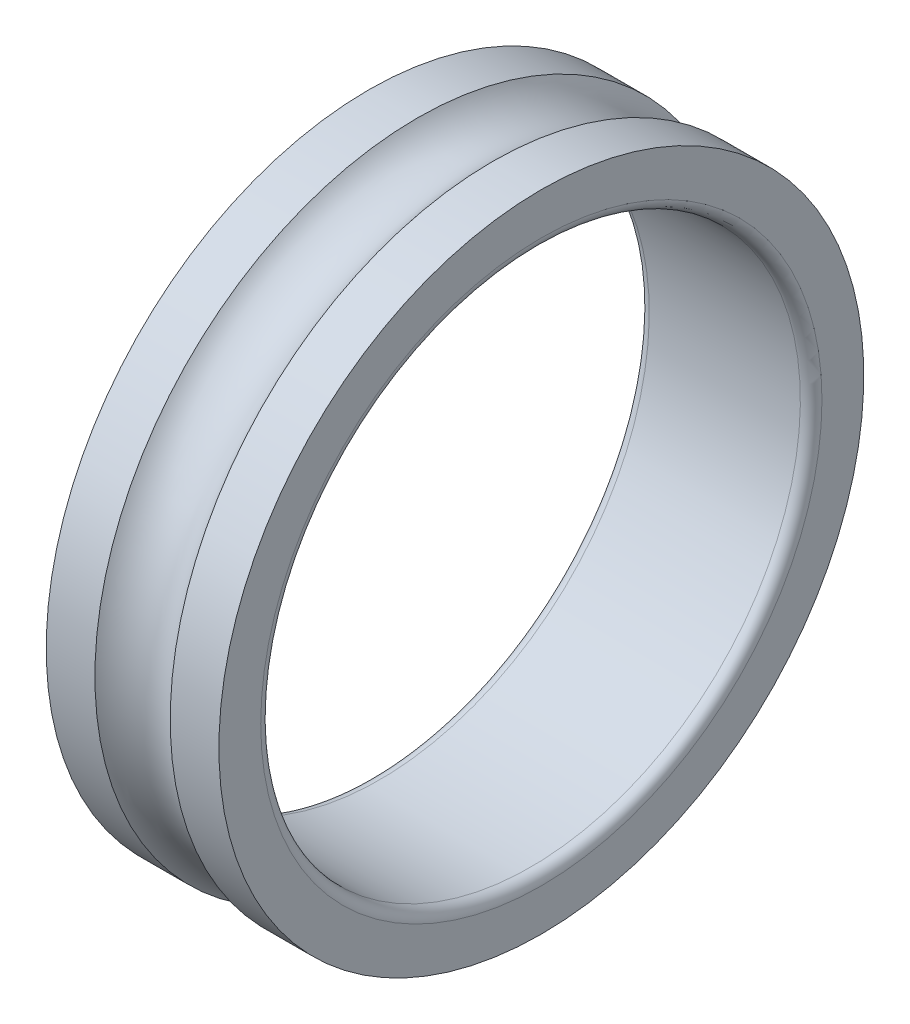
ISO-10303-21;
HEADER;
FILE_DESCRIPTION(('STEP AP214'),'2;1');
FILE_NAME('part.step','',(''),(''),'','','');
FILE_SCHEMA(('AUTOMOTIVE_DESIGN { 1 0 10303 214 1 1 1 1 }'));
ENDSEC;
DATA;
#1=APPLICATION_CONTEXT('core data for automotive mechanical design processes');
#2=APPLICATION_PROTOCOL_DEFINITION('international standard','automotive_design',2000,#1);
#3=PRODUCT_CONTEXT('',#1,'mechanical');
#4=PRODUCT('Part','Part','',(#3));
#5=PRODUCT_RELATED_PRODUCT_CATEGORY('part','',(#4));
#6=PRODUCT_DEFINITION_FORMATION('','',#4);
#7=PRODUCT_DEFINITION_CONTEXT('part definition',#1,'design');
#8=PRODUCT_DEFINITION('design','',#6,#7);
#9=PRODUCT_DEFINITION_SHAPE('','',#8);
#10=(LENGTH_UNIT() NAMED_UNIT(*) SI_UNIT(.MILLI.,.METRE.));
#11=(NAMED_UNIT(*) PLANE_ANGLE_UNIT() SI_UNIT($,.RADIAN.));
#12=(NAMED_UNIT(*) SI_UNIT($,.STERADIAN.) SOLID_ANGLE_UNIT());
#13=UNCERTAINTY_MEASURE_WITH_UNIT(LENGTH_MEASURE(1.E-05),#10,'distance_accuracy_value','');
#14=(GEOMETRIC_REPRESENTATION_CONTEXT(3) GLOBAL_UNCERTAINTY_ASSIGNED_CONTEXT((#13)) GLOBAL_UNIT_ASSIGNED_CONTEXT((#10,
#11,#12)) REPRESENTATION_CONTEXT('',''));
#15=CARTESIAN_POINT('',(0.,0.,0.));
#16=DIRECTION('',(0.,0.,1.));
#17=DIRECTION('',(1.,0.,0.));
#18=AXIS2_PLACEMENT_3D('',#15,#16,#17);
#19=CARTESIAN_POINT('',(13.7440588615354,0.,0.));
#20=DIRECTION('',(-1.,0.,0.));
#21=DIRECTION('',(0.,1.,0.));
#22=AXIS2_PLACEMENT_3D('',#19,#20,#21);
#23=CYLINDRICAL_SURFACE('',#22,29.875);
#24=CARTESIAN_POINT('',(11.4881177230707,0.,0.));
#25=DIRECTION('',(1.,0.,0.));
#26=DIRECTION('',(0.,1.,0.));
#27=AXIS2_PLACEMENT_3D('',#24,#25,#26);
#28=CIRCLE('',#27,29.875);
#29=CARTESIAN_POINT('',(11.4881177230707,29.875,0.));
#30=VERTEX_POINT('',#29);
#31=EDGE_CURVE('E11',#30,#30,#28,.T.);
#32=ORIENTED_EDGE('',*,*,#31,.T.);
#33=EDGE_LOOP('',(#32));
#34=FACE_BOUND('',#33,.T.);
#35=CARTESIAN_POINT('',(16.,0.,0.));
#36=DIRECTION('',(1.,0.,0.));
#37=DIRECTION('',(0.,1.,0.));
#38=AXIS2_PLACEMENT_3D('',#35,#36,#37);
#39=CIRCLE('',#38,29.875);
#40=CARTESIAN_POINT('',(16.,29.875,0.));
#41=VERTEX_POINT('',#40);
#42=EDGE_CURVE('E62',#41,#41,#39,.T.);
#43=ORIENTED_EDGE('',*,*,#42,.F.);
#44=EDGE_LOOP('',(#43));
#45=FACE_BOUND('',#44,.T.);
#46=ADVANCED_FACE('F16',(#34,#45),#23,.T.);
#47=CARTESIAN_POINT('',(8.,0.,0.));
#48=DIRECTION('',(1.,0.,0.));
#49=DIRECTION('',(0.,0.,-1.));
#50=AXIS2_PLACEMENT_3D('',#47,#48,#49);
#51=TOROIDAL_SURFACE('',#50,32.5,4.3655);
#52=CARTESIAN_POINT('',(4.51188227692929,0.,0.));
#53=DIRECTION('',(1.,0.,0.));
#54=DIRECTION('',(0.,1.,0.));
#55=AXIS2_PLACEMENT_3D('',#52,#53,#54);
#56=CIRCLE('',#55,29.875);
#57=CARTESIAN_POINT('',(4.51188227692929,29.875,0.));
#58=VERTEX_POINT('',#57);
#59=EDGE_CURVE('E26',#58,#58,#56,.T.);
#60=ORIENTED_EDGE('',*,*,#59,.T.);
#61=EDGE_LOOP('',(#60));
#62=FACE_BOUND('',#61,.T.);
#63=ORIENTED_EDGE('',*,*,#31,.F.);
#64=EDGE_LOOP('',(#63));
#65=FACE_BOUND('',#64,.T.);
#66=ADVANCED_FACE('F18',(#62,#65),#51,.F.);
#67=CARTESIAN_POINT('',(2.25594113846464,0.,0.));
#68=DIRECTION('',(-1.,0.,0.));
#69=DIRECTION('',(0.,1.,0.));
#70=AXIS2_PLACEMENT_3D('',#67,#68,#69);
#71=CYLINDRICAL_SURFACE('',#70,29.875);
#72=CARTESIAN_POINT('',(0.,0.,0.));
#73=DIRECTION('',(1.,0.,0.));
#74=DIRECTION('',(0.,1.,0.));
#75=AXIS2_PLACEMENT_3D('',#72,#73,#74);
#76=CIRCLE('',#75,29.875);
#77=CARTESIAN_POINT('',(0.,29.875,0.));
#78=VERTEX_POINT('',#77);
#79=EDGE_CURVE('E54',#78,#78,#76,.T.);
#80=ORIENTED_EDGE('',*,*,#79,.T.);
#81=EDGE_LOOP('',(#80));
#82=FACE_BOUND('',#81,.T.);
#83=ORIENTED_EDGE('',*,*,#59,.F.);
#84=EDGE_LOOP('',(#83));
#85=FACE_BOUND('',#84,.T.);
#86=ADVANCED_FACE('F55',(#82,#85),#71,.T.);
#87=CARTESIAN_POINT('',(0.,27.9375,0.));
#88=DIRECTION('',(-1.,0.,0.));
#89=DIRECTION('',(0.,-1.,0.));
#90=AXIS2_PLACEMENT_3D('',#87,#88,#89);
#91=PLANE('',#90);
#92=CARTESIAN_POINT('',(0.,0.,0.));
#93=DIRECTION('',(1.,0.,0.));
#94=DIRECTION('',(0.,1.,0.));
#95=AXIS2_PLACEMENT_3D('',#92,#93,#94);
#96=CIRCLE('',#95,26.);
#97=CARTESIAN_POINT('',(0.,26.,0.));
#98=VERTEX_POINT('',#97);
#99=EDGE_CURVE('E50',#98,#98,#96,.T.);
#100=ORIENTED_EDGE('',*,*,#99,.T.);
#101=EDGE_LOOP('',(#100));
#102=FACE_BOUND('',#101,.T.);
#103=ORIENTED_EDGE('',*,*,#79,.F.);
#104=EDGE_LOOP('',(#103));
#105=FACE_BOUND('',#104,.T.);
#106=ADVANCED_FACE('F93',(#102,#105),#91,.T.);
#107=CARTESIAN_POINT('',(1.,0.,0.));
#108=DIRECTION('',(1.,0.,0.));
#109=DIRECTION('',(0.,0.,-1.));
#110=AXIS2_PLACEMENT_3D('',#107,#108,#109);
#111=TOROIDAL_SURFACE('',#110,26.,1.);
#112=CARTESIAN_POINT('',(1.,0.,0.));
#113=DIRECTION('',(1.,0.,0.));
#114=DIRECTION('',(0.,1.,0.));
#115=AXIS2_PLACEMENT_3D('',#112,#113,#114);
#116=CIRCLE('',#115,25.);
#117=CARTESIAN_POINT('',(1.,25.,0.));
#118=VERTEX_POINT('',#117);
#119=EDGE_CURVE('E20',#118,#118,#116,.T.);
#120=ORIENTED_EDGE('',*,*,#119,.T.);
#121=EDGE_LOOP('',(#120));
#122=FACE_BOUND('',#121,.T.);
#123=ORIENTED_EDGE('',*,*,#99,.F.);
#124=EDGE_LOOP('',(#123));
#125=FACE_BOUND('',#124,.T.);
#126=ADVANCED_FACE('F90',(#122,#125),#111,.T.);
#127=CARTESIAN_POINT('',(8.,0.,0.));
#128=DIRECTION('',(-1.,0.,0.));
#129=DIRECTION('',(0.,1.,0.));
#130=AXIS2_PLACEMENT_3D('',#127,#128,#129);
#131=CYLINDRICAL_SURFACE('',#130,25.);
#132=CARTESIAN_POINT('',(15.,0.,0.));
#133=DIRECTION('',(1.,0.,0.));
#134=DIRECTION('',(0.,1.,0.));
#135=AXIS2_PLACEMENT_3D('',#132,#133,#134);
#136=CIRCLE('',#135,25.);
#137=CARTESIAN_POINT('',(15.,25.,0.));
#138=VERTEX_POINT('',#137);
#139=EDGE_CURVE('E63',#138,#138,#136,.T.);
#140=ORIENTED_EDGE('',*,*,#139,.T.);
#141=EDGE_LOOP('',(#140));
#142=FACE_BOUND('',#141,.T.);
#143=ORIENTED_EDGE('',*,*,#119,.F.);
#144=EDGE_LOOP('',(#143));
#145=FACE_BOUND('',#144,.T.);
#146=ADVANCED_FACE('F79',(#142,#145),#131,.F.);
#147=CARTESIAN_POINT('',(15.,0.,0.));
#148=DIRECTION('',(1.,0.,0.));
#149=DIRECTION('',(0.,0.,-1.));
#150=AXIS2_PLACEMENT_3D('',#147,#148,#149);
#151=TOROIDAL_SURFACE('',#150,26.,1.);
#152=CARTESIAN_POINT('',(16.,0.,0.));
#153=DIRECTION('',(1.,0.,0.));
#154=DIRECTION('',(0.,1.,0.));
#155=AXIS2_PLACEMENT_3D('',#152,#153,#154);
#156=CIRCLE('',#155,26.);
#157=CARTESIAN_POINT('',(16.,26.,0.));
#158=VERTEX_POINT('',#157);
#159=EDGE_CURVE('E64',#158,#158,#156,.T.);
#160=ORIENTED_EDGE('',*,*,#159,.T.);
#161=EDGE_LOOP('',(#160));
#162=FACE_BOUND('',#161,.T.);
#163=ORIENTED_EDGE('',*,*,#139,.F.);
#164=EDGE_LOOP('',(#163));
#165=FACE_BOUND('',#164,.T.);
#166=ADVANCED_FACE('F68',(#162,#165),#151,.T.);
#167=CARTESIAN_POINT('',(16.,27.9375,0.));
#168=DIRECTION('',(1.,0.,0.));
#169=DIRECTION('',(0.,1.,0.));
#170=AXIS2_PLACEMENT_3D('',#167,#168,#169);
#171=PLANE('',#170);
#172=ORIENTED_EDGE('',*,*,#42,.T.);
#173=EDGE_LOOP('',(#172));
#174=FACE_BOUND('',#173,.T.);
#175=ORIENTED_EDGE('',*,*,#159,.F.);
#176=EDGE_LOOP('',(#175));
#177=FACE_BOUND('',#176,.T.);
#178=ADVANCED_FACE('F71',(#174,#177),#171,.T.);
#179=CLOSED_SHELL('',(#46,#66,#86,#106,#126,#146,#166,#178));
#180=MANIFOLD_SOLID_BREP('B1',#179);
#181=ADVANCED_BREP_SHAPE_REPRESENTATION('',(#18,#180),#14);
#182=SHAPE_DEFINITION_REPRESENTATION(#9,#181);
ENDSEC;
END-ISO-10303-21;
